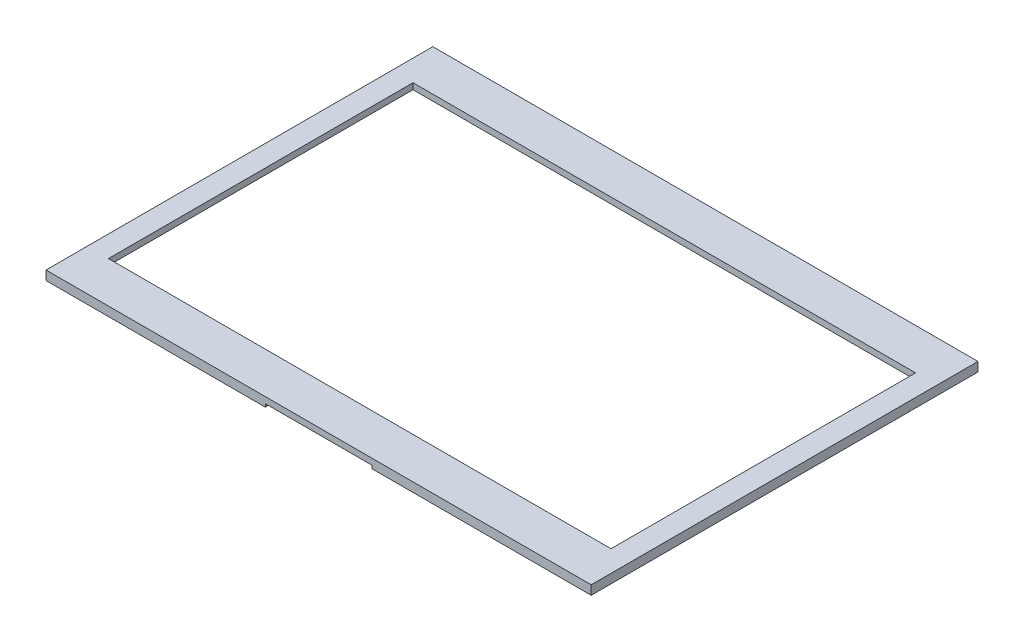
ISO-10303-21;
HEADER;
FILE_DESCRIPTION(('STEP AP214'),'2;1');
FILE_NAME('part.step','',(''),(''),'','','');
FILE_SCHEMA(('AUTOMOTIVE_DESIGN { 1 0 10303 214 1 1 1 1 }'));
ENDSEC;
DATA;
#1=APPLICATION_CONTEXT('core data for automotive mechanical design processes');
#2=APPLICATION_PROTOCOL_DEFINITION('international standard','automotive_design',2000,#1);
#3=PRODUCT_CONTEXT('',#1,'mechanical');
#4=PRODUCT('Part','Part','',(#3));
#5=PRODUCT_RELATED_PRODUCT_CATEGORY('part','',(#4));
#6=PRODUCT_DEFINITION_FORMATION('','',#4);
#7=PRODUCT_DEFINITION_CONTEXT('part definition',#1,'design');
#8=PRODUCT_DEFINITION('design','',#6,#7);
#9=PRODUCT_DEFINITION_SHAPE('','',#8);
#10=(LENGTH_UNIT() NAMED_UNIT(*) SI_UNIT(.MILLI.,.METRE.));
#11=(NAMED_UNIT(*) PLANE_ANGLE_UNIT() SI_UNIT($,.RADIAN.));
#12=(NAMED_UNIT(*) SI_UNIT($,.STERADIAN.) SOLID_ANGLE_UNIT());
#13=UNCERTAINTY_MEASURE_WITH_UNIT(LENGTH_MEASURE(1.E-05),#10,'distance_accuracy_value','');
#14=(GEOMETRIC_REPRESENTATION_CONTEXT(3) GLOBAL_UNCERTAINTY_ASSIGNED_CONTEXT((#13)) GLOBAL_UNIT_ASSIGNED_CONTEXT((#10,
#11,#12)) REPRESENTATION_CONTEXT('',''));
#15=CARTESIAN_POINT('',(0.,0.,0.));
#16=DIRECTION('',(0.,0.,1.));
#17=DIRECTION('',(1.,0.,0.));
#18=AXIS2_PLACEMENT_3D('',#15,#16,#17);
#19=CARTESIAN_POINT('',(0.,3.,0.));
#20=DIRECTION('',(0.,0.,-1.));
#21=DIRECTION('',(-1.,0.,0.));
#22=AXIS2_PLACEMENT_3D('',#19,#20,#21);
#23=PLANE('',#22);
#24=DIRECTION('',(1.,0.,0.));
#25=VECTOR('',#24,1.);
#26=CARTESIAN_POINT('',(72.,1.,0.));
#27=LINE('',#26,#25);
#28=CARTESIAN_POINT('',(72.,1.,0.));
#29=VERTEX_POINT('',#28);
#30=CARTESIAN_POINT('',(107.,1.,0.));
#31=VERTEX_POINT('',#30);
#32=EDGE_CURVE('E237',#29,#31,#27,.T.);
#33=ORIENTED_EDGE('',*,*,#32,.T.);
#34=DIRECTION('',(0.,-1.,0.));
#35=VECTOR('',#34,1.);
#36=CARTESIAN_POINT('',(107.,1.,0.));
#37=LINE('',#36,#35);
#38=CARTESIAN_POINT('',(107.,0.,0.));
#39=VERTEX_POINT('',#38);
#40=EDGE_CURVE('E238',#31,#39,#37,.T.);
#41=ORIENTED_EDGE('',*,*,#40,.T.);
#42=DIRECTION('',(1.,0.,0.));
#43=VECTOR('',#42,1.);
#44=CARTESIAN_POINT('',(0.,0.,0.));
#45=LINE('',#44,#43);
#46=CARTESIAN_POINT('',(179.,0.,0.));
#47=VERTEX_POINT('',#46);
#48=EDGE_CURVE('E271',#39,#47,#45,.T.);
#49=ORIENTED_EDGE('',*,*,#48,.T.);
#50=DIRECTION('',(0.,-1.,0.));
#51=VECTOR('',#50,1.);
#52=CARTESIAN_POINT('',(179.,3.,0.));
#53=LINE('',#52,#51);
#54=CARTESIAN_POINT('',(179.,3.,0.));
#55=VERTEX_POINT('',#54);
#56=EDGE_CURVE('E94',#55,#47,#53,.T.);
#57=ORIENTED_EDGE('',*,*,#56,.F.);
#58=DIRECTION('',(1.,0.,0.));
#59=VECTOR('',#58,1.);
#60=CARTESIAN_POINT('',(0.,3.,0.));
#61=LINE('',#60,#59);
#62=CARTESIAN_POINT('',(0.,3.,0.));
#63=VERTEX_POINT('',#62);
#64=EDGE_CURVE('E278',#63,#55,#61,.T.);
#65=ORIENTED_EDGE('',*,*,#64,.F.);
#66=DIRECTION('',(0.,-1.,0.));
#67=VECTOR('',#66,1.);
#68=CARTESIAN_POINT('',(0.,3.,0.));
#69=LINE('',#68,#67);
#70=CARTESIAN_POINT('',(0.,0.,0.));
#71=VERTEX_POINT('',#70);
#72=EDGE_CURVE('E295',#63,#71,#69,.T.);
#73=ORIENTED_EDGE('',*,*,#72,.T.);
#74=CARTESIAN_POINT('',(72.,0.,0.));
#75=VERTEX_POINT('',#74);
#76=EDGE_CURVE('E291',#71,#75,#45,.T.);
#77=ORIENTED_EDGE('',*,*,#76,.T.);
#78=DIRECTION('',(0.,-1.,0.));
#79=VECTOR('',#78,1.);
#80=CARTESIAN_POINT('',(72.,1.,0.));
#81=LINE('',#80,#79);
#82=EDGE_CURVE('E242',#29,#75,#81,.T.);
#83=ORIENTED_EDGE('',*,*,#82,.F.);
#84=EDGE_LOOP('',(#33,#41,#49,#57,#65,#73,#77,#83));
#85=FACE_BOUND('',#84,.T.);
#86=ADVANCED_FACE('F87',(#85),#23,.F.);
#87=CARTESIAN_POINT('',(179.,3.,0.));
#88=DIRECTION('',(-1.,0.,0.));
#89=DIRECTION('',(0.,0.,1.));
#90=AXIS2_PLACEMENT_3D('',#87,#88,#89);
#91=PLANE('',#90);
#92=DIRECTION('',(0.,0.,-1.));
#93=VECTOR('',#92,1.);
#94=CARTESIAN_POINT('',(179.,0.,0.));
#95=LINE('',#94,#93);
#96=CARTESIAN_POINT('',(179.,0.,-127.));
#97=VERTEX_POINT('',#96);
#98=EDGE_CURVE('E299',#47,#97,#95,.T.);
#99=ORIENTED_EDGE('',*,*,#98,.T.);
#100=DIRECTION('',(0.,-1.,0.));
#101=VECTOR('',#100,1.);
#102=CARTESIAN_POINT('',(179.,3.,-127.));
#103=LINE('',#102,#101);
#104=CARTESIAN_POINT('',(179.,3.,-127.));
#105=VERTEX_POINT('',#104);
#106=EDGE_CURVE('E307',#105,#97,#103,.T.);
#107=ORIENTED_EDGE('',*,*,#106,.F.);
#108=DIRECTION('',(0.,0.,-1.));
#109=VECTOR('',#108,1.);
#110=CARTESIAN_POINT('',(179.,3.,0.));
#111=LINE('',#110,#109);
#112=EDGE_CURVE('E285',#55,#105,#111,.T.);
#113=ORIENTED_EDGE('',*,*,#112,.F.);
#114=ORIENTED_EDGE('',*,*,#56,.T.);
#115=EDGE_LOOP('',(#99,#107,#113,#114));
#116=FACE_BOUND('',#115,.T.);
#117=ADVANCED_FACE('F313',(#116),#91,.F.);
#118=CARTESIAN_POINT('',(0.,3.,-127.));
#119=DIRECTION('',(0.,0.,-1.));
#120=DIRECTION('',(-1.,0.,0.));
#121=AXIS2_PLACEMENT_3D('',#118,#119,#120);
#122=PLANE('',#121);
#123=DIRECTION('',(1.,0.,0.));
#124=VECTOR('',#123,1.);
#125=CARTESIAN_POINT('',(0.,0.,-127.));
#126=LINE('',#125,#124);
#127=CARTESIAN_POINT('',(0.,0.,-127.));
#128=VERTEX_POINT('',#127);
#129=EDGE_CURVE('E298',#128,#97,#126,.T.);
#130=ORIENTED_EDGE('',*,*,#129,.F.);
#131=DIRECTION('',(0.,-1.,0.));
#132=VECTOR('',#131,1.);
#133=CARTESIAN_POINT('',(0.,3.,-127.));
#134=LINE('',#133,#132);
#135=CARTESIAN_POINT('',(0.,3.,-127.));
#136=VERTEX_POINT('',#135);
#137=EDGE_CURVE('E301',#136,#128,#134,.T.);
#138=ORIENTED_EDGE('',*,*,#137,.F.);
#139=DIRECTION('',(1.,0.,0.));
#140=VECTOR('',#139,1.);
#141=CARTESIAN_POINT('',(0.,3.,-127.));
#142=LINE('',#141,#140);
#143=EDGE_CURVE('E287',#136,#105,#142,.T.);
#144=ORIENTED_EDGE('',*,*,#143,.T.);
#145=ORIENTED_EDGE('',*,*,#106,.T.);
#146=EDGE_LOOP('',(#130,#138,#144,#145));
#147=FACE_BOUND('',#146,.T.);
#148=ADVANCED_FACE('F324',(#147),#122,.T.);
#149=CARTESIAN_POINT('',(0.,3.,0.));
#150=DIRECTION('',(-1.,0.,0.));
#151=DIRECTION('',(0.,0.,1.));
#152=AXIS2_PLACEMENT_3D('',#149,#150,#151);
#153=PLANE('',#152);
#154=DIRECTION('',(0.,0.,-1.));
#155=VECTOR('',#154,1.);
#156=CARTESIAN_POINT('',(0.,0.,0.));
#157=LINE('',#156,#155);
#158=EDGE_CURVE('E283',#71,#128,#157,.T.);
#159=ORIENTED_EDGE('',*,*,#158,.F.);
#160=ORIENTED_EDGE('',*,*,#72,.F.);
#161=DIRECTION('',(0.,0.,-1.));
#162=VECTOR('',#161,1.);
#163=CARTESIAN_POINT('',(0.,3.,0.));
#164=LINE('',#163,#162);
#165=EDGE_CURVE('E289',#63,#136,#164,.T.);
#166=ORIENTED_EDGE('',*,*,#165,.T.);
#167=ORIENTED_EDGE('',*,*,#137,.T.);
#168=EDGE_LOOP('',(#159,#160,#166,#167));
#169=FACE_BOUND('',#168,.T.);
#170=ADVANCED_FACE('F329',(#169),#153,.T.);
#171=CARTESIAN_POINT('',(0.,3.,0.));
#172=DIRECTION('',(0.,1.,0.));
#173=DIRECTION('',(0.,0.,1.));
#174=AXIS2_PLACEMENT_3D('',#171,#172,#173);
#175=PLANE('',#174);
#176=DIRECTION('',(-1.,0.,0.));
#177=VECTOR('',#176,1.);
#178=CARTESIAN_POINT('',(172.,3.,-13.5));
#179=LINE('',#178,#177);
#180=CARTESIAN_POINT('',(172.,3.,-13.5));
#181=VERTEX_POINT('',#180);
#182=CARTESIAN_POINT('',(7.00000000000001,3.,-13.5));
#183=VERTEX_POINT('',#182);
#184=EDGE_CURVE('E258',#181,#183,#179,.T.);
#185=ORIENTED_EDGE('',*,*,#184,.T.);
#186=DIRECTION('',(0.,0.,-1.));
#187=VECTOR('',#186,1.);
#188=CARTESIAN_POINT('',(7.00000000000001,3.,-13.5));
#189=LINE('',#188,#187);
#190=CARTESIAN_POINT('',(7.00000000000001,3.,-113.5));
#191=VERTEX_POINT('',#190);
#192=EDGE_CURVE('E259',#183,#191,#189,.T.);
#193=ORIENTED_EDGE('',*,*,#192,.T.);
#194=DIRECTION('',(-1.,0.,0.));
#195=VECTOR('',#194,1.);
#196=CARTESIAN_POINT('',(172.,3.,-113.5));
#197=LINE('',#196,#195);
#198=CARTESIAN_POINT('',(172.,3.,-113.5));
#199=VERTEX_POINT('',#198);
#200=EDGE_CURVE('E265',#199,#191,#197,.T.);
#201=ORIENTED_EDGE('',*,*,#200,.F.);
#202=DIRECTION('',(0.,0.,-1.));
#203=VECTOR('',#202,1.);
#204=CARTESIAN_POINT('',(172.,3.,-13.5));
#205=LINE('',#204,#203);
#206=EDGE_CURVE('E264',#181,#199,#205,.T.);
#207=ORIENTED_EDGE('',*,*,#206,.F.);
#208=EDGE_LOOP('',(#185,#193,#201,#207));
#209=FACE_BOUND('',#208,.T.);
#210=ORIENTED_EDGE('',*,*,#64,.T.);
#211=ORIENTED_EDGE('',*,*,#112,.T.);
#212=ORIENTED_EDGE('',*,*,#143,.F.);
#213=ORIENTED_EDGE('',*,*,#165,.F.);
#214=EDGE_LOOP('',(#210,#211,#212,#213));
#215=FACE_BOUND('',#214,.T.);
#216=ADVANCED_FACE('F327',(#209,#215),#175,.T.);
#217=CARTESIAN_POINT('',(0.,0.,0.));
#218=DIRECTION('',(0.,1.,0.));
#219=DIRECTION('',(0.,0.,1.));
#220=AXIS2_PLACEMENT_3D('',#217,#218,#219);
#221=PLANE('',#220);
#222=DIRECTION('',(1.,0.,0.));
#223=VECTOR('',#222,1.);
#224=CARTESIAN_POINT('',(3.5,0.,-3.49999999999998));
#225=LINE('',#224,#223);
#226=CARTESIAN_POINT('',(3.5,0.,-3.49999999999998));
#227=VERTEX_POINT('',#226);
#228=CARTESIAN_POINT('',(72.,0.,-3.49999999999998));
#229=VERTEX_POINT('',#228);
#230=EDGE_CURVE('E224',#227,#229,#225,.T.);
#231=ORIENTED_EDGE('',*,*,#230,.T.);
#232=DIRECTION('',(0.,0.,1.));
#233=VECTOR('',#232,1.);
#234=CARTESIAN_POINT('',(72.,0.,-3.49999999999998));
#235=LINE('',#234,#233);
#236=EDGE_CURVE('E101',#229,#75,#235,.T.);
#237=ORIENTED_EDGE('',*,*,#236,.T.);
#238=ORIENTED_EDGE('',*,*,#76,.F.);
#239=ORIENTED_EDGE('',*,*,#158,.T.);
#240=ORIENTED_EDGE('',*,*,#129,.T.);
#241=ORIENTED_EDGE('',*,*,#98,.F.);
#242=ORIENTED_EDGE('',*,*,#48,.F.);
#243=DIRECTION('',(0.,0.,1.));
#244=VECTOR('',#243,1.);
#245=CARTESIAN_POINT('',(107.,0.,-3.49999999999999));
#246=LINE('',#245,#244);
#247=CARTESIAN_POINT('',(107.,0.,-3.49999999999998));
#248=VERTEX_POINT('',#247);
#249=EDGE_CURVE('E244',#248,#39,#246,.T.);
#250=ORIENTED_EDGE('',*,*,#249,.F.);
#251=CARTESIAN_POINT('',(175.5,0.,-3.49999999999998));
#252=VERTEX_POINT('',#251);
#253=EDGE_CURVE('E331',#248,#252,#225,.T.);
#254=ORIENTED_EDGE('',*,*,#253,.T.);
#255=DIRECTION('',(0.,0.,1.));
#256=VECTOR('',#255,1.);
#257=CARTESIAN_POINT('',(175.5,0.,-115.5));
#258=LINE('',#257,#256);
#259=CARTESIAN_POINT('',(175.5,0.,-115.5));
#260=VERTEX_POINT('',#259);
#261=EDGE_CURVE('E334',#260,#252,#258,.T.);
#262=ORIENTED_EDGE('',*,*,#261,.F.);
#263=DIRECTION('',(1.,0.,0.));
#264=VECTOR('',#263,1.);
#265=CARTESIAN_POINT('',(3.5,0.,-115.5));
#266=LINE('',#265,#264);
#267=CARTESIAN_POINT('',(3.5,0.,-115.5));
#268=VERTEX_POINT('',#267);
#269=EDGE_CURVE('E218',#268,#260,#266,.T.);
#270=ORIENTED_EDGE('',*,*,#269,.F.);
#271=DIRECTION('',(0.,0.,1.));
#272=VECTOR('',#271,1.);
#273=CARTESIAN_POINT('',(3.5,0.,-115.5));
#274=LINE('',#273,#272);
#275=EDGE_CURVE('E250',#268,#227,#274,.T.);
#276=ORIENTED_EDGE('',*,*,#275,.T.);
#277=EDGE_LOOP('',(#231,#237,#238,#239,#240,#241,#242,#250,#254,#262,#270,#276));
#278=FACE_BOUND('',#277,.T.);
#279=ADVANCED_FACE('F319',(#278),#221,.F.);
#280=CARTESIAN_POINT('',(172.,3.,-13.5));
#281=DIRECTION('',(0.,0.,1.));
#282=DIRECTION('',(1.,0.,0.));
#283=AXIS2_PLACEMENT_3D('',#280,#281,#282);
#284=PLANE('',#283);
#285=DIRECTION('',(0.,-1.,0.));
#286=VECTOR('',#285,1.);
#287=CARTESIAN_POINT('',(172.,3.,-13.5));
#288=LINE('',#287,#286);
#289=CARTESIAN_POINT('',(172.,1.,-13.5));
#290=VERTEX_POINT('',#289);
#291=EDGE_CURVE('E268',#181,#290,#288,.T.);
#292=ORIENTED_EDGE('',*,*,#291,.T.);
#293=DIRECTION('',(-1.,0.,0.));
#294=VECTOR('',#293,1.);
#295=CARTESIAN_POINT('',(172.,1.,-13.5));
#296=LINE('',#295,#294);
#297=CARTESIAN_POINT('',(7.00000000000001,1.,-13.5));
#298=VERTEX_POINT('',#297);
#299=EDGE_CURVE('E251',#290,#298,#296,.T.);
#300=ORIENTED_EDGE('',*,*,#299,.T.);
#301=DIRECTION('',(0.,-1.,0.));
#302=VECTOR('',#301,1.);
#303=CARTESIAN_POINT('',(7.00000000000001,3.,-13.5));
#304=LINE('',#303,#302);
#305=EDGE_CURVE('E270',#183,#298,#304,.T.);
#306=ORIENTED_EDGE('',*,*,#305,.F.);
#307=ORIENTED_EDGE('',*,*,#184,.F.);
#308=EDGE_LOOP('',(#292,#300,#306,#307));
#309=FACE_BOUND('',#308,.T.);
#310=ADVANCED_FACE('F384',(#309),#284,.F.);
#311=CARTESIAN_POINT('',(172.,3.,-13.5));
#312=DIRECTION('',(-1.,0.,0.));
#313=DIRECTION('',(0.,0.,1.));
#314=AXIS2_PLACEMENT_3D('',#311,#312,#313);
#315=PLANE('',#314);
#316=DIRECTION('',(0.,0.,-1.));
#317=VECTOR('',#316,1.);
#318=CARTESIAN_POINT('',(172.,1.,-13.5));
#319=LINE('',#318,#317);
#320=CARTESIAN_POINT('',(172.,1.,-113.5));
#321=VERTEX_POINT('',#320);
#322=EDGE_CURVE('E253',#290,#321,#319,.T.);
#323=ORIENTED_EDGE('',*,*,#322,.F.);
#324=ORIENTED_EDGE('',*,*,#291,.F.);
#325=ORIENTED_EDGE('',*,*,#206,.T.);
#326=DIRECTION('',(0.,-1.,0.));
#327=VECTOR('',#326,1.);
#328=CARTESIAN_POINT('',(172.,3.,-113.5));
#329=LINE('',#328,#327);
#330=EDGE_CURVE('E275',#199,#321,#329,.T.);
#331=ORIENTED_EDGE('',*,*,#330,.T.);
#332=EDGE_LOOP('',(#323,#324,#325,#331));
#333=FACE_BOUND('',#332,.T.);
#334=ADVANCED_FACE('F388',(#333),#315,.T.);
#335=CARTESIAN_POINT('',(172.,3.,-113.5));
#336=DIRECTION('',(0.,0.,1.));
#337=DIRECTION('',(1.,0.,0.));
#338=AXIS2_PLACEMENT_3D('',#335,#336,#337);
#339=PLANE('',#338);
#340=DIRECTION('',(-1.,0.,0.));
#341=VECTOR('',#340,1.);
#342=CARTESIAN_POINT('',(172.,1.,-113.5));
#343=LINE('',#342,#341);
#344=CARTESIAN_POINT('',(7.00000000000001,1.,-113.5));
#345=VERTEX_POINT('',#344);
#346=EDGE_CURVE('E108',#321,#345,#343,.T.);
#347=ORIENTED_EDGE('',*,*,#346,.F.);
#348=ORIENTED_EDGE('',*,*,#330,.F.);
#349=ORIENTED_EDGE('',*,*,#200,.T.);
#350=DIRECTION('',(0.,-1.,0.));
#351=VECTOR('',#350,1.);
#352=CARTESIAN_POINT('',(7.00000000000001,3.,-113.5));
#353=LINE('',#352,#351);
#354=EDGE_CURVE('E274',#191,#345,#353,.T.);
#355=ORIENTED_EDGE('',*,*,#354,.T.);
#356=EDGE_LOOP('',(#347,#348,#349,#355));
#357=FACE_BOUND('',#356,.T.);
#358=ADVANCED_FACE('F392',(#357),#339,.T.);
#359=CARTESIAN_POINT('',(7.00000000000001,3.,-13.5));
#360=DIRECTION('',(-1.,0.,0.));
#361=DIRECTION('',(0.,0.,1.));
#362=AXIS2_PLACEMENT_3D('',#359,#360,#361);
#363=PLANE('',#362);
#364=ORIENTED_EDGE('',*,*,#305,.T.);
#365=DIRECTION('',(0.,0.,-1.));
#366=VECTOR('',#365,1.);
#367=CARTESIAN_POINT('',(7.00000000000001,1.,-13.5));
#368=LINE('',#367,#366);
#369=EDGE_CURVE('E12',#298,#345,#368,.T.);
#370=ORIENTED_EDGE('',*,*,#369,.T.);
#371=ORIENTED_EDGE('',*,*,#354,.F.);
#372=ORIENTED_EDGE('',*,*,#192,.F.);
#373=EDGE_LOOP('',(#364,#370,#371,#372));
#374=FACE_BOUND('',#373,.T.);
#375=ADVANCED_FACE('F391',(#374),#363,.F.);
#376=CARTESIAN_POINT('',(0.,1.,0.));
#377=DIRECTION('',(0.,1.,0.));
#378=DIRECTION('',(0.,0.,1.));
#379=AXIS2_PLACEMENT_3D('',#376,#377,#378);
#380=PLANE('',#379);
#381=DIRECTION('',(0.,0.,1.));
#382=VECTOR('',#381,1.);
#383=CARTESIAN_POINT('',(3.5,1.,-115.5));
#384=LINE('',#383,#382);
#385=CARTESIAN_POINT('',(3.5,1.,-115.5));
#386=VERTEX_POINT('',#385);
#387=CARTESIAN_POINT('',(3.5,1.,-3.49999999999998));
#388=VERTEX_POINT('',#387);
#389=EDGE_CURVE('E201',#386,#388,#384,.T.);
#390=ORIENTED_EDGE('',*,*,#389,.F.);
#391=DIRECTION('',(1.,0.,0.));
#392=VECTOR('',#391,1.);
#393=CARTESIAN_POINT('',(3.5,1.,-115.5));
#394=LINE('',#393,#392);
#395=CARTESIAN_POINT('',(175.5,1.,-115.5));
#396=VERTEX_POINT('',#395);
#397=EDGE_CURVE('E344',#386,#396,#394,.T.);
#398=ORIENTED_EDGE('',*,*,#397,.T.);
#399=DIRECTION('',(0.,0.,1.));
#400=VECTOR('',#399,1.);
#401=CARTESIAN_POINT('',(175.5,1.,-115.5));
#402=LINE('',#401,#400);
#403=CARTESIAN_POINT('',(175.5,1.,-3.49999999999998));
#404=VERTEX_POINT('',#403);
#405=EDGE_CURVE('E207',#396,#404,#402,.T.);
#406=ORIENTED_EDGE('',*,*,#405,.T.);
#407=DIRECTION('',(1.,0.,0.));
#408=VECTOR('',#407,1.);
#409=CARTESIAN_POINT('',(3.5,1.,-3.49999999999998));
#410=LINE('',#409,#408);
#411=CARTESIAN_POINT('',(107.,1.,-3.49999999999998));
#412=VERTEX_POINT('',#411);
#413=EDGE_CURVE('E209',#412,#404,#410,.T.);
#414=ORIENTED_EDGE('',*,*,#413,.F.);
#415=DIRECTION('',(0.,0.,1.));
#416=VECTOR('',#415,1.);
#417=CARTESIAN_POINT('',(107.,1.,-3.49999999999999));
#418=LINE('',#417,#416);
#419=EDGE_CURVE('E233',#412,#31,#418,.T.);
#420=ORIENTED_EDGE('',*,*,#419,.T.);
#421=ORIENTED_EDGE('',*,*,#32,.F.);
#422=DIRECTION('',(0.,0.,1.));
#423=VECTOR('',#422,1.);
#424=CARTESIAN_POINT('',(72.,1.,-3.49999999999998));
#425=LINE('',#424,#423);
#426=CARTESIAN_POINT('',(72.,1.,-3.49999999999998));
#427=VERTEX_POINT('',#426);
#428=EDGE_CURVE('E206',#427,#29,#425,.T.);
#429=ORIENTED_EDGE('',*,*,#428,.F.);
#430=EDGE_CURVE('E200',#388,#427,#410,.T.);
#431=ORIENTED_EDGE('',*,*,#430,.F.);
#432=EDGE_LOOP('',(#390,#398,#406,#414,#420,#421,#429,#431));
#433=FACE_BOUND('',#432,.T.);
#434=ORIENTED_EDGE('',*,*,#322,.T.);
#435=ORIENTED_EDGE('',*,*,#346,.T.);
#436=ORIENTED_EDGE('',*,*,#369,.F.);
#437=ORIENTED_EDGE('',*,*,#299,.F.);
#438=EDGE_LOOP('',(#434,#435,#436,#437));
#439=FACE_BOUND('',#438,.T.);
#440=ADVANCED_FACE('F203',(#433,#439),#380,.F.);
#441=CARTESIAN_POINT('',(3.5,1.,-115.5));
#442=DIRECTION('',(0.,0.,-1.));
#443=DIRECTION('',(-1.,0.,0.));
#444=AXIS2_PLACEMENT_3D('',#441,#442,#443);
#445=PLANE('',#444);
#446=ORIENTED_EDGE('',*,*,#269,.T.);
#447=DIRECTION('',(0.,-1.,0.));
#448=VECTOR('',#447,1.);
#449=CARTESIAN_POINT('',(175.5,1.,-115.5));
#450=LINE('',#449,#448);
#451=EDGE_CURVE('E228',#396,#260,#450,.T.);
#452=ORIENTED_EDGE('',*,*,#451,.F.);
#453=ORIENTED_EDGE('',*,*,#397,.F.);
#454=DIRECTION('',(0.,-1.,0.));
#455=VECTOR('',#454,1.);
#456=CARTESIAN_POINT('',(3.5,1.,-115.5));
#457=LINE('',#456,#455);
#458=EDGE_CURVE('E217',#386,#268,#457,.T.);
#459=ORIENTED_EDGE('',*,*,#458,.T.);
#460=EDGE_LOOP('',(#446,#452,#453,#459));
#461=FACE_BOUND('',#460,.T.);
#462=ADVANCED_FACE('F351',(#461),#445,.F.);
#463=CARTESIAN_POINT('',(3.5,1.,-115.5));
#464=DIRECTION('',(1.,0.,0.));
#465=DIRECTION('',(0.,0.,-1.));
#466=AXIS2_PLACEMENT_3D('',#463,#464,#465);
#467=PLANE('',#466);
#468=ORIENTED_EDGE('',*,*,#275,.F.);
#469=ORIENTED_EDGE('',*,*,#458,.F.);
#470=ORIENTED_EDGE('',*,*,#389,.T.);
#471=DIRECTION('',(0.,-1.,0.));
#472=VECTOR('',#471,1.);
#473=CARTESIAN_POINT('',(3.5,1.,-3.49999999999998));
#474=LINE('',#473,#472);
#475=EDGE_CURVE('E216',#388,#227,#474,.T.);
#476=ORIENTED_EDGE('',*,*,#475,.T.);
#477=EDGE_LOOP('',(#468,#469,#470,#476));
#478=FACE_BOUND('',#477,.T.);
#479=ADVANCED_FACE('F214',(#478),#467,.T.);
#480=CARTESIAN_POINT('',(175.5,1.,-115.5));
#481=DIRECTION('',(1.,0.,0.));
#482=DIRECTION('',(0.,0.,-1.));
#483=AXIS2_PLACEMENT_3D('',#480,#481,#482);
#484=PLANE('',#483);
#485=ORIENTED_EDGE('',*,*,#261,.T.);
#486=DIRECTION('',(0.,-1.,0.));
#487=VECTOR('',#486,1.);
#488=CARTESIAN_POINT('',(175.5,1.,-3.49999999999998));
#489=LINE('',#488,#487);
#490=EDGE_CURVE('E223',#404,#252,#489,.T.);
#491=ORIENTED_EDGE('',*,*,#490,.F.);
#492=ORIENTED_EDGE('',*,*,#405,.F.);
#493=ORIENTED_EDGE('',*,*,#451,.T.);
#494=EDGE_LOOP('',(#485,#491,#492,#493));
#495=FACE_BOUND('',#494,.T.);
#496=ADVANCED_FACE('F350',(#495),#484,.F.);
#497=CARTESIAN_POINT('',(3.5,1.,-3.49999999999998));
#498=DIRECTION('',(0.,0.,-1.));
#499=DIRECTION('',(-1.,0.,0.));
#500=AXIS2_PLACEMENT_3D('',#497,#498,#499);
#501=PLANE('',#500);
#502=ORIENTED_EDGE('',*,*,#413,.T.);
#503=ORIENTED_EDGE('',*,*,#490,.T.);
#504=ORIENTED_EDGE('',*,*,#253,.F.);
#505=DIRECTION('',(0.,-1.,0.));
#506=VECTOR('',#505,1.);
#507=CARTESIAN_POINT('',(107.,1.,-3.49999999999999));
#508=LINE('',#507,#506);
#509=EDGE_CURVE('E221',#412,#248,#508,.T.);
#510=ORIENTED_EDGE('',*,*,#509,.F.);
#511=EDGE_LOOP('',(#502,#503,#504,#510));
#512=FACE_BOUND('',#511,.T.);
#513=ADVANCED_FACE('F352',(#512),#501,.T.);
#514=DIRECTION('',(0.,-1.,0.));
#515=VECTOR('',#514,1.);
#516=CARTESIAN_POINT('',(72.,1.,-3.49999999999998));
#517=LINE('',#516,#515);
#518=EDGE_CURVE('E226',#427,#229,#517,.T.);
#519=ORIENTED_EDGE('',*,*,#518,.T.);
#520=ORIENTED_EDGE('',*,*,#230,.F.);
#521=ORIENTED_EDGE('',*,*,#475,.F.);
#522=ORIENTED_EDGE('',*,*,#430,.T.);
#523=EDGE_LOOP('',(#519,#520,#521,#522));
#524=FACE_BOUND('',#523,.T.);
#525=ADVANCED_FACE('F222',(#524),#501,.T.);
#526=CARTESIAN_POINT('',(107.,1.,-3.49999999999999));
#527=DIRECTION('',(1.,0.,0.));
#528=DIRECTION('',(0.,0.,-1.));
#529=AXIS2_PLACEMENT_3D('',#526,#527,#528);
#530=PLANE('',#529);
#531=ORIENTED_EDGE('',*,*,#249,.T.);
#532=ORIENTED_EDGE('',*,*,#40,.F.);
#533=ORIENTED_EDGE('',*,*,#419,.F.);
#534=ORIENTED_EDGE('',*,*,#509,.T.);
#535=EDGE_LOOP('',(#531,#532,#533,#534));
#536=FACE_BOUND('',#535,.T.);
#537=ADVANCED_FACE('F362',(#536),#530,.F.);
#538=CARTESIAN_POINT('',(72.,1.,-3.49999999999998));
#539=DIRECTION('',(1.,0.,0.));
#540=DIRECTION('',(0.,0.,-1.));
#541=AXIS2_PLACEMENT_3D('',#538,#539,#540);
#542=PLANE('',#541);
#543=ORIENTED_EDGE('',*,*,#236,.F.);
#544=ORIENTED_EDGE('',*,*,#518,.F.);
#545=ORIENTED_EDGE('',*,*,#428,.T.);
#546=ORIENTED_EDGE('',*,*,#82,.T.);
#547=EDGE_LOOP('',(#543,#544,#545,#546));
#548=FACE_BOUND('',#547,.T.);
#549=ADVANCED_FACE('F356',(#548),#542,.T.);
#550=CLOSED_SHELL('',(#86,#117,#148,#170,#216,#279,#310,#334,#358,#375,#440,#462,#479,#496,#513,
#525,#537,#549));
#551=MANIFOLD_SOLID_BREP('B2',#550);
#552=ADVANCED_BREP_SHAPE_REPRESENTATION('',(#18,#551),#14);
#553=SHAPE_DEFINITION_REPRESENTATION(#9,#552);
ENDSEC;
END-ISO-10303-21;
